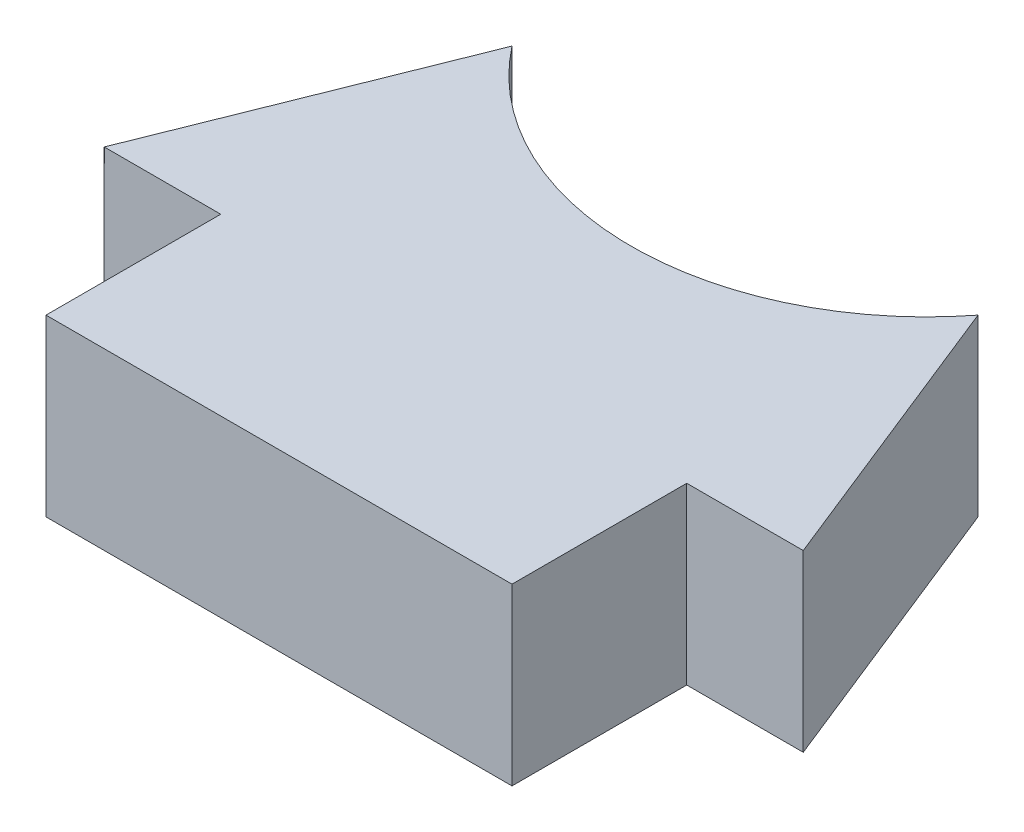
ISO-10303-21;
HEADER;
FILE_DESCRIPTION(('STEP AP214'),'2;1');
FILE_NAME('part.step','',(''),(''),'','','');
FILE_SCHEMA(('AUTOMOTIVE_DESIGN { 1 0 10303 214 1 1 1 1 }'));
ENDSEC;
DATA;
#1=APPLICATION_CONTEXT('core data for automotive mechanical design processes');
#2=APPLICATION_PROTOCOL_DEFINITION('international standard','automotive_design',2000,#1);
#3=PRODUCT_CONTEXT('',#1,'mechanical');
#4=PRODUCT('Part','Part','',(#3));
#5=PRODUCT_RELATED_PRODUCT_CATEGORY('part','',(#4));
#6=PRODUCT_DEFINITION_FORMATION('','',#4);
#7=PRODUCT_DEFINITION_CONTEXT('part definition',#1,'design');
#8=PRODUCT_DEFINITION('design','',#6,#7);
#9=PRODUCT_DEFINITION_SHAPE('','',#8);
#10=(LENGTH_UNIT() NAMED_UNIT(*) SI_UNIT(.MILLI.,.METRE.));
#11=(NAMED_UNIT(*) PLANE_ANGLE_UNIT() SI_UNIT($,.RADIAN.));
#12=(NAMED_UNIT(*) SI_UNIT($,.STERADIAN.) SOLID_ANGLE_UNIT());
#13=UNCERTAINTY_MEASURE_WITH_UNIT(LENGTH_MEASURE(1.E-05),#10,'distance_accuracy_value','');
#14=(GEOMETRIC_REPRESENTATION_CONTEXT(3) GLOBAL_UNCERTAINTY_ASSIGNED_CONTEXT((#13)) GLOBAL_UNIT_ASSIGNED_CONTEXT((#10,
#11,#12)) REPRESENTATION_CONTEXT('',''));
#15=CARTESIAN_POINT('',(0.,0.,0.));
#16=DIRECTION('',(0.,0.,1.));
#17=DIRECTION('',(1.,0.,0.));
#18=AXIS2_PLACEMENT_3D('',#15,#16,#17);
#19=CARTESIAN_POINT('',(-12.8321809012211,3.,16.7535646179387));
#20=DIRECTION('',(1.,0.,0.));
#21=DIRECTION('',(0.,0.,-1.));
#22=AXIS2_PLACEMENT_3D('',#19,#20,#21);
#23=PLANE('',#22);
#24=DIRECTION('',(0.,0.,1.));
#25=VECTOR('',#24,1.);
#26=CARTESIAN_POINT('',(-12.8321809012211,0.,16.7535646179387));
#27=LINE('',#26,#25);
#28=CARTESIAN_POINT('',(-12.8321809012211,0.,13.7535646179387));
#29=VERTEX_POINT('',#28);
#30=CARTESIAN_POINT('',(-12.8321809012211,0.,16.7535646179387));
#31=VERTEX_POINT('',#30);
#32=EDGE_CURVE('E146',#29,#31,#27,.T.);
#33=ORIENTED_EDGE('',*,*,#32,.T.);
#34=DIRECTION('',(0.,-1.,0.));
#35=VECTOR('',#34,1.);
#36=CARTESIAN_POINT('',(-12.8321809012211,3.,16.7535646179387));
#37=LINE('',#36,#35);
#38=CARTESIAN_POINT('',(-12.8321809012211,3.,16.7535646179387));
#39=VERTEX_POINT('',#38);
#40=EDGE_CURVE('E11',#39,#31,#37,.T.);
#41=ORIENTED_EDGE('',*,*,#40,.F.);
#42=DIRECTION('',(0.,0.,1.));
#43=VECTOR('',#42,1.);
#44=CARTESIAN_POINT('',(-12.8321809012211,3.,16.7535646179387));
#45=LINE('',#44,#43);
#46=CARTESIAN_POINT('',(-12.8321809012211,3.,13.7535646179387));
#47=VERTEX_POINT('',#46);
#48=EDGE_CURVE('E168',#47,#39,#45,.T.);
#49=ORIENTED_EDGE('',*,*,#48,.F.);
#50=DIRECTION('',(0.,-1.,0.));
#51=VECTOR('',#50,1.);
#52=CARTESIAN_POINT('',(-12.8321809012211,3.,13.7535646179387));
#53=LINE('',#52,#51);
#54=EDGE_CURVE('E142',#47,#29,#53,.T.);
#55=ORIENTED_EDGE('',*,*,#54,.T.);
#56=EDGE_LOOP('',(#33,#41,#49,#55));
#57=FACE_BOUND('',#56,.T.);
#58=ADVANCED_FACE('F45',(#57),#23,.F.);
#59=CARTESIAN_POINT('',(-12.8321809012211,3.,16.7535646179387));
#60=DIRECTION('',(0.,0.,-1.));
#61=DIRECTION('',(-1.,0.,0.));
#62=AXIS2_PLACEMENT_3D('',#59,#60,#61);
#63=PLANE('',#62);
#64=DIRECTION('',(1.,0.,0.));
#65=VECTOR('',#64,1.);
#66=CARTESIAN_POINT('',(-12.8321809012211,0.,16.7535646179387));
#67=LINE('',#66,#65);
#68=CARTESIAN_POINT('',(-4.83218090122108,0.,16.7535646179387));
#69=VERTEX_POINT('',#68);
#70=EDGE_CURVE('E150',#31,#69,#67,.T.);
#71=ORIENTED_EDGE('',*,*,#70,.T.);
#72=DIRECTION('',(0.,-1.,0.));
#73=VECTOR('',#72,1.);
#74=CARTESIAN_POINT('',(-4.83218090122108,3.,16.7535646179387));
#75=LINE('',#74,#73);
#76=CARTESIAN_POINT('',(-4.83218090122108,3.,16.7535646179387));
#77=VERTEX_POINT('',#76);
#78=EDGE_CURVE('E54',#77,#69,#75,.T.);
#79=ORIENTED_EDGE('',*,*,#78,.F.);
#80=DIRECTION('',(1.,0.,0.));
#81=VECTOR('',#80,1.);
#82=CARTESIAN_POINT('',(-12.8321809012211,3.,16.7535646179387));
#83=LINE('',#82,#81);
#84=EDGE_CURVE('E105',#39,#77,#83,.T.);
#85=ORIENTED_EDGE('',*,*,#84,.F.);
#86=ORIENTED_EDGE('',*,*,#40,.T.);
#87=EDGE_LOOP('',(#71,#79,#85,#86));
#88=FACE_BOUND('',#87,.T.);
#89=ADVANCED_FACE('F214',(#88),#63,.F.);
#90=CARTESIAN_POINT('',(-4.83218090122108,3.,16.7535646179387));
#91=DIRECTION('',(-1.,0.,0.));
#92=DIRECTION('',(0.,0.,1.));
#93=AXIS2_PLACEMENT_3D('',#90,#91,#92);
#94=PLANE('',#93);
#95=DIRECTION('',(0.,0.,-1.));
#96=VECTOR('',#95,1.);
#97=CARTESIAN_POINT('',(-4.83218090122108,0.,16.7535646179387));
#98=LINE('',#97,#96);
#99=CARTESIAN_POINT('',(-4.83218090122108,0.,13.7535646179387));
#100=VERTEX_POINT('',#99);
#101=EDGE_CURVE('E153',#69,#100,#98,.T.);
#102=ORIENTED_EDGE('',*,*,#101,.T.);
#103=DIRECTION('',(0.,-1.,0.));
#104=VECTOR('',#103,1.);
#105=CARTESIAN_POINT('',(-4.83218090122108,3.,13.7535646179387));
#106=LINE('',#105,#104);
#107=CARTESIAN_POINT('',(-4.83218090122108,3.,13.7535646179387));
#108=VERTEX_POINT('',#107);
#109=EDGE_CURVE('E179',#108,#100,#106,.T.);
#110=ORIENTED_EDGE('',*,*,#109,.F.);
#111=DIRECTION('',(0.,0.,-1.));
#112=VECTOR('',#111,1.);
#113=CARTESIAN_POINT('',(-4.83218090122108,3.,16.7535646179387));
#114=LINE('',#113,#112);
#115=EDGE_CURVE('E189',#77,#108,#114,.T.);
#116=ORIENTED_EDGE('',*,*,#115,.F.);
#117=ORIENTED_EDGE('',*,*,#78,.T.);
#118=EDGE_LOOP('',(#102,#110,#116,#117));
#119=FACE_BOUND('',#118,.T.);
#120=ADVANCED_FACE('F187',(#119),#94,.F.);
#121=CARTESIAN_POINT('',(-4.83218090122108,3.,13.7535646179387));
#122=DIRECTION('',(0.,0.,-1.));
#123=DIRECTION('',(-1.,0.,0.));
#124=AXIS2_PLACEMENT_3D('',#121,#122,#123);
#125=PLANE('',#124);
#126=DIRECTION('',(1.,0.,0.));
#127=VECTOR('',#126,1.);
#128=CARTESIAN_POINT('',(-4.83218090122108,0.,13.7535646179387));
#129=LINE('',#128,#127);
#130=CARTESIAN_POINT('',(-2.83218090122108,0.,13.7535646179387));
#131=VERTEX_POINT('',#130);
#132=EDGE_CURVE('E156',#100,#131,#129,.T.);
#133=ORIENTED_EDGE('',*,*,#132,.T.);
#134=DIRECTION('',(0.,-1.,0.));
#135=VECTOR('',#134,1.);
#136=CARTESIAN_POINT('',(-2.83218090122108,3.,13.7535646179387));
#137=LINE('',#136,#135);
#138=CARTESIAN_POINT('',(-2.83218090122108,3.,13.7535646179387));
#139=VERTEX_POINT('',#138);
#140=EDGE_CURVE('E175',#139,#131,#137,.T.);
#141=ORIENTED_EDGE('',*,*,#140,.F.);
#142=DIRECTION('',(1.,0.,0.));
#143=VECTOR('',#142,1.);
#144=CARTESIAN_POINT('',(-4.83218090122108,3.,13.7535646179387));
#145=LINE('',#144,#143);
#146=EDGE_CURVE('E202',#108,#139,#145,.T.);
#147=ORIENTED_EDGE('',*,*,#146,.F.);
#148=ORIENTED_EDGE('',*,*,#109,.T.);
#149=EDGE_LOOP('',(#133,#141,#147,#148));
#150=FACE_BOUND('',#149,.T.);
#151=ADVANCED_FACE('F197',(#150),#125,.F.);
#152=CARTESIAN_POINT('',(-2.83218090122108,3.,13.7535646179387));
#153=DIRECTION('',(-0.928476690885259,0.,0.371390676354104));
#154=DIRECTION('',(0.371390676354104,0.,0.928476690885259));
#155=AXIS2_PLACEMENT_3D('',#152,#153,#154);
#156=PLANE('',#155);
#157=DIRECTION('',(-0.371390676354104,0.,-0.928476690885259));
#158=VECTOR('',#157,1.);
#159=CARTESIAN_POINT('',(-2.83218090122108,0.,13.7535646179387));
#160=LINE('',#159,#158);
#161=CARTESIAN_POINT('',(-4.83218090122108,0.,8.75356461793869));
#162=VERTEX_POINT('',#161);
#163=EDGE_CURVE('E159',#131,#162,#160,.T.);
#164=ORIENTED_EDGE('',*,*,#163,.T.);
#165=DIRECTION('',(0.,-1.,0.));
#166=VECTOR('',#165,1.);
#167=CARTESIAN_POINT('',(-4.83218090122108,3.,8.75356461793869));
#168=LINE('',#167,#166);
#169=CARTESIAN_POINT('',(-4.83218090122108,3.,8.75356461793869));
#170=VERTEX_POINT('',#169);
#171=EDGE_CURVE('E135',#170,#162,#168,.T.);
#172=ORIENTED_EDGE('',*,*,#171,.F.);
#173=DIRECTION('',(-0.371390676354104,0.,-0.928476690885259));
#174=VECTOR('',#173,1.);
#175=CARTESIAN_POINT('',(-2.83218090122108,3.,13.7535646179387));
#176=LINE('',#175,#174);
#177=EDGE_CURVE('E124',#139,#170,#176,.T.);
#178=ORIENTED_EDGE('',*,*,#177,.F.);
#179=ORIENTED_EDGE('',*,*,#140,.T.);
#180=EDGE_LOOP('',(#164,#172,#178,#179));
#181=FACE_BOUND('',#180,.T.);
#182=ADVANCED_FACE('F200',(#181),#156,.F.);
#183=CARTESIAN_POINT('',(-8.83218090122108,3.,5.63543568899015));
#184=DIRECTION('',(0.,-1.,0.));
#185=DIRECTION('',(0.,0.,-1.));
#186=AXIS2_PLACEMENT_3D('',#183,#184,#185);
#187=CYLINDRICAL_SURFACE('',#186,5.07175788238612);
#188=CARTESIAN_POINT('',(-8.83218090122108,0.,5.63543568899015));
#189=DIRECTION('',(0.,-1.,0.));
#190=DIRECTION('',(0.,0.,-1.));
#191=AXIS2_PLACEMENT_3D('',#188,#189,#190);
#192=CIRCLE('',#191,5.07175788238612);
#193=CARTESIAN_POINT('',(-12.8321809012211,0.,8.75356461793869));
#194=VERTEX_POINT('',#193);
#195=EDGE_CURVE('E133',#162,#194,#192,.T.);
#196=ORIENTED_EDGE('',*,*,#195,.T.);
#197=DIRECTION('',(0.,-1.,0.));
#198=VECTOR('',#197,1.);
#199=CARTESIAN_POINT('',(-12.8321809012211,3.,8.75356461793869));
#200=LINE('',#199,#198);
#201=CARTESIAN_POINT('',(-12.8321809012211,3.,8.75356461793869));
#202=VERTEX_POINT('',#201);
#203=EDGE_CURVE('E130',#202,#194,#200,.T.);
#204=ORIENTED_EDGE('',*,*,#203,.F.);
#205=CARTESIAN_POINT('',(-8.83218090122108,3.,5.63543568899015));
#206=DIRECTION('',(0.,-1.,0.));
#207=DIRECTION('',(0.,0.,-1.));
#208=AXIS2_PLACEMENT_3D('',#205,#206,#207);
#209=CIRCLE('',#208,5.07175788238612);
#210=EDGE_CURVE('E118',#170,#202,#209,.T.);
#211=ORIENTED_EDGE('',*,*,#210,.F.);
#212=ORIENTED_EDGE('',*,*,#171,.T.);
#213=EDGE_LOOP('',(#196,#204,#211,#212));
#214=FACE_BOUND('',#213,.T.);
#215=ADVANCED_FACE('F131',(#214),#187,.F.);
#216=CARTESIAN_POINT('',(-14.8321809012211,3.,13.7535646179387));
#217=DIRECTION('',(0.928476690885259,0.,0.371390676354104));
#218=DIRECTION('',(0.371390676354104,0.,-0.928476690885259));
#219=AXIS2_PLACEMENT_3D('',#216,#217,#218);
#220=PLANE('',#219);
#221=DIRECTION('',(-0.371390676354104,0.,0.928476690885259));
#222=VECTOR('',#221,1.);
#223=CARTESIAN_POINT('',(-14.8321809012211,0.,13.7535646179387));
#224=LINE('',#223,#222);
#225=CARTESIAN_POINT('',(-14.8321809012211,0.,13.7535646179387));
#226=VERTEX_POINT('',#225);
#227=EDGE_CURVE('E91',#194,#226,#224,.T.);
#228=ORIENTED_EDGE('',*,*,#227,.T.);
#229=DIRECTION('',(0.,-1.,0.));
#230=VECTOR('',#229,1.);
#231=CARTESIAN_POINT('',(-14.8321809012211,3.,13.7535646179387));
#232=LINE('',#231,#230);
#233=CARTESIAN_POINT('',(-14.8321809012211,3.,13.7535646179387));
#234=VERTEX_POINT('',#233);
#235=EDGE_CURVE('E136',#234,#226,#232,.T.);
#236=ORIENTED_EDGE('',*,*,#235,.F.);
#237=DIRECTION('',(-0.371390676354104,0.,0.928476690885259));
#238=VECTOR('',#237,1.);
#239=CARTESIAN_POINT('',(-14.8321809012211,3.,13.7535646179387));
#240=LINE('',#239,#238);
#241=EDGE_CURVE('E122',#202,#234,#240,.T.);
#242=ORIENTED_EDGE('',*,*,#241,.F.);
#243=ORIENTED_EDGE('',*,*,#203,.T.);
#244=EDGE_LOOP('',(#228,#236,#242,#243));
#245=FACE_BOUND('',#244,.T.);
#246=ADVANCED_FACE('F138',(#245),#220,.F.);
#247=CARTESIAN_POINT('',(-12.8321809012211,3.,13.7535646179387));
#248=DIRECTION('',(0.,0.,-1.));
#249=DIRECTION('',(-1.,0.,0.));
#250=AXIS2_PLACEMENT_3D('',#247,#248,#249);
#251=PLANE('',#250);
#252=DIRECTION('',(1.,0.,0.));
#253=VECTOR('',#252,1.);
#254=CARTESIAN_POINT('',(-12.8321809012211,0.,13.7535646179387));
#255=LINE('',#254,#253);
#256=EDGE_CURVE('E97',#226,#29,#255,.T.);
#257=ORIENTED_EDGE('',*,*,#256,.T.);
#258=ORIENTED_EDGE('',*,*,#54,.F.);
#259=DIRECTION('',(1.,0.,0.));
#260=VECTOR('',#259,1.);
#261=CARTESIAN_POINT('',(-12.8321809012211,3.,13.7535646179387));
#262=LINE('',#261,#260);
#263=EDGE_CURVE('E62',#234,#47,#262,.T.);
#264=ORIENTED_EDGE('',*,*,#263,.F.);
#265=ORIENTED_EDGE('',*,*,#235,.T.);
#266=EDGE_LOOP('',(#257,#258,#264,#265));
#267=FACE_BOUND('',#266,.T.);
#268=ADVANCED_FACE('F230',(#267),#251,.F.);
#269=CARTESIAN_POINT('',(-8.83218090122108,3.,5.63543568899015));
#270=DIRECTION('',(0.,-1.,0.));
#271=DIRECTION('',(0.,0.,-1.));
#272=AXIS2_PLACEMENT_3D('',#269,#270,#271);
#273=PLANE('',#272);
#274=ORIENTED_EDGE('',*,*,#48,.T.);
#275=ORIENTED_EDGE('',*,*,#84,.T.);
#276=ORIENTED_EDGE('',*,*,#115,.T.);
#277=ORIENTED_EDGE('',*,*,#146,.T.);
#278=ORIENTED_EDGE('',*,*,#177,.T.);
#279=ORIENTED_EDGE('',*,*,#210,.T.);
#280=ORIENTED_EDGE('',*,*,#241,.T.);
#281=ORIENTED_EDGE('',*,*,#263,.T.);
#282=EDGE_LOOP('',(#274,#275,#276,#277,#278,#279,#280,#281));
#283=FACE_BOUND('',#282,.T.);
#284=ADVANCED_FACE('F120',(#283),#273,.F.);
#285=CARTESIAN_POINT('',(-8.83218090122108,0.,5.63543568899015));
#286=DIRECTION('',(0.,-1.,0.));
#287=DIRECTION('',(0.,0.,-1.));
#288=AXIS2_PLACEMENT_3D('',#285,#286,#287);
#289=PLANE('',#288);
#290=ORIENTED_EDGE('',*,*,#32,.F.);
#291=ORIENTED_EDGE('',*,*,#256,.F.);
#292=ORIENTED_EDGE('',*,*,#227,.F.);
#293=ORIENTED_EDGE('',*,*,#195,.F.);
#294=ORIENTED_EDGE('',*,*,#163,.F.);
#295=ORIENTED_EDGE('',*,*,#132,.F.);
#296=ORIENTED_EDGE('',*,*,#101,.F.);
#297=ORIENTED_EDGE('',*,*,#70,.F.);
#298=EDGE_LOOP('',(#290,#291,#292,#293,#294,#295,#296,#297));
#299=FACE_BOUND('',#298,.T.);
#300=ADVANCED_FACE('F193',(#299),#289,.T.);
#301=CLOSED_SHELL('',(#58,#89,#120,#151,#182,#215,#246,#268,#284,#300));
#302=MANIFOLD_SOLID_BREP('B2',#301);
#303=ADVANCED_BREP_SHAPE_REPRESENTATION('',(#18,#302),#14);
#304=SHAPE_DEFINITION_REPRESENTATION(#9,#303);
ENDSEC;
END-ISO-10303-21;
